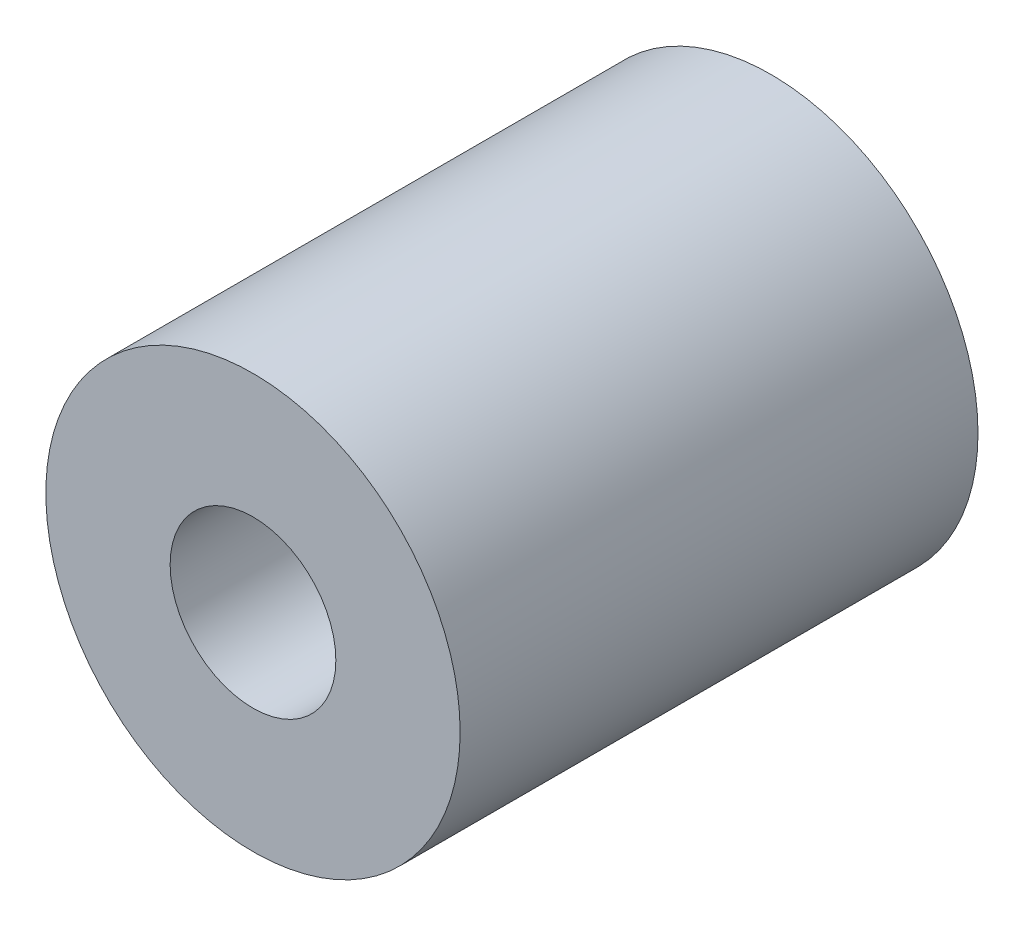
ISO-10303-21;
HEADER;
FILE_DESCRIPTION(('STEP AP214'),'2;1');
FILE_NAME('part.step','',(''),(''),'','','');
FILE_SCHEMA(('AUTOMOTIVE_DESIGN { 1 0 10303 214 1 1 1 1 }'));
ENDSEC;
DATA;
#1=APPLICATION_CONTEXT('core data for automotive mechanical design processes');
#2=APPLICATION_PROTOCOL_DEFINITION('international standard','automotive_design',2000,#1);
#3=PRODUCT_CONTEXT('',#1,'mechanical');
#4=PRODUCT('Part','Part','',(#3));
#5=PRODUCT_RELATED_PRODUCT_CATEGORY('part','',(#4));
#6=PRODUCT_DEFINITION_FORMATION('','',#4);
#7=PRODUCT_DEFINITION_CONTEXT('part definition',#1,'design');
#8=PRODUCT_DEFINITION('design','',#6,#7);
#9=PRODUCT_DEFINITION_SHAPE('','',#8);
#10=(LENGTH_UNIT() NAMED_UNIT(*) SI_UNIT(.MILLI.,.METRE.));
#11=(NAMED_UNIT(*) PLANE_ANGLE_UNIT() SI_UNIT($,.RADIAN.));
#12=(NAMED_UNIT(*) SI_UNIT($,.STERADIAN.) SOLID_ANGLE_UNIT());
#13=UNCERTAINTY_MEASURE_WITH_UNIT(LENGTH_MEASURE(1.E-05),#10,'distance_accuracy_value','');
#14=(GEOMETRIC_REPRESENTATION_CONTEXT(3) GLOBAL_UNCERTAINTY_ASSIGNED_CONTEXT((#13)) GLOBAL_UNIT_ASSIGNED_CONTEXT((#10,
#11,#12)) REPRESENTATION_CONTEXT('',''));
#15=CARTESIAN_POINT('',(0.,0.,0.));
#16=DIRECTION('',(0.,0.,1.));
#17=DIRECTION('',(1.,0.,0.));
#18=AXIS2_PLACEMENT_3D('',#15,#16,#17);
#19=CARTESIAN_POINT('',(0.,0.,25.));
#20=DIRECTION('',(0.,0.,-1.));
#21=DIRECTION('',(-1.,0.,0.));
#22=AXIS2_PLACEMENT_3D('',#19,#20,#21);
#23=CYLINDRICAL_SURFACE('',#22,10.);
#24=CARTESIAN_POINT('',(0.,0.,25.));
#25=DIRECTION('',(0.,0.,1.));
#26=DIRECTION('',(1.,0.,0.));
#27=AXIS2_PLACEMENT_3D('',#24,#25,#26);
#28=CIRCLE('',#27,10.);
#29=CARTESIAN_POINT('',(10.,0.,25.));
#30=VERTEX_POINT('',#29);
#31=EDGE_CURVE('E10',#30,#30,#28,.T.);
#32=ORIENTED_EDGE('',*,*,#31,.F.);
#33=EDGE_LOOP('',(#32));
#34=FACE_BOUND('',#33,.T.);
#35=CARTESIAN_POINT('',(0.,0.,0.));
#36=DIRECTION('',(0.,0.,1.));
#37=DIRECTION('',(1.,0.,0.));
#38=AXIS2_PLACEMENT_3D('',#35,#36,#37);
#39=CIRCLE('',#38,10.);
#40=CARTESIAN_POINT('',(10.,0.,0.));
#41=VERTEX_POINT('',#40);
#42=EDGE_CURVE('E44',#41,#41,#39,.T.);
#43=ORIENTED_EDGE('',*,*,#42,.T.);
#44=EDGE_LOOP('',(#43));
#45=FACE_BOUND('',#44,.T.);
#46=ADVANCED_FACE('F37',(#34,#45),#23,.T.);
#47=CARTESIAN_POINT('',(0.,0.,25.));
#48=DIRECTION('',(0.,0.,1.));
#49=DIRECTION('',(1.,0.,0.));
#50=AXIS2_PLACEMENT_3D('',#47,#48,#49);
#51=PLANE('',#50);
#52=CARTESIAN_POINT('',(0.,0.,25.));
#53=DIRECTION('',(0.,0.,1.));
#54=DIRECTION('',(1.,0.,0.));
#55=AXIS2_PLACEMENT_3D('',#52,#53,#54);
#56=CIRCLE('',#55,4.);
#57=CARTESIAN_POINT('',(4.,0.,25.));
#58=VERTEX_POINT('',#57);
#59=EDGE_CURVE('E49',#58,#58,#56,.T.);
#60=ORIENTED_EDGE('',*,*,#59,.F.);
#61=EDGE_LOOP('',(#60));
#62=FACE_BOUND('',#61,.T.);
#63=ORIENTED_EDGE('',*,*,#31,.T.);
#64=EDGE_LOOP('',(#63));
#65=FACE_BOUND('',#64,.T.);
#66=ADVANCED_FACE('F72',(#62,#65),#51,.T.);
#67=CARTESIAN_POINT('',(0.,0.,0.));
#68=DIRECTION('',(0.,0.,1.));
#69=DIRECTION('',(1.,0.,0.));
#70=AXIS2_PLACEMENT_3D('',#67,#68,#69);
#71=PLANE('',#70);
#72=CARTESIAN_POINT('',(0.,0.,0.));
#73=DIRECTION('',(0.,0.,-1.));
#74=DIRECTION('',(-1.,0.,0.));
#75=AXIS2_PLACEMENT_3D('',#72,#73,#74);
#76=CIRCLE('',#75,5.);
#77=CARTESIAN_POINT('',(-5.,0.,0.));
#78=VERTEX_POINT('',#77);
#79=EDGE_CURVE('E54',#78,#78,#76,.T.);
#80=ORIENTED_EDGE('',*,*,#79,.F.);
#81=EDGE_LOOP('',(#80));
#82=FACE_BOUND('',#81,.T.);
#83=ORIENTED_EDGE('',*,*,#42,.F.);
#84=EDGE_LOOP('',(#83));
#85=FACE_BOUND('',#84,.T.);
#86=ADVANCED_FACE('F69',(#82,#85),#71,.F.);
#87=CARTESIAN_POINT('',(0.,0.,17.5));
#88=DIRECTION('',(0.,0.,1.));
#89=DIRECTION('',(1.,0.,0.));
#90=AXIS2_PLACEMENT_3D('',#87,#88,#89);
#91=CYLINDRICAL_SURFACE('',#90,4.);
#92=ORIENTED_EDGE('',*,*,#59,.T.);
#93=EDGE_LOOP('',(#92));
#94=FACE_BOUND('',#93,.T.);
#95=CARTESIAN_POINT('',(0.,0.,12.5));
#96=DIRECTION('',(0.,0.,-1.));
#97=DIRECTION('',(-1.,0.,0.));
#98=AXIS2_PLACEMENT_3D('',#95,#96,#97);
#99=CIRCLE('',#98,4.);
#100=CARTESIAN_POINT('',(-4.,0.,12.5));
#101=VERTEX_POINT('',#100);
#102=EDGE_CURVE('E40',#101,#101,#99,.T.);
#103=ORIENTED_EDGE('',*,*,#102,.T.);
#104=EDGE_LOOP('',(#103));
#105=FACE_BOUND('',#104,.T.);
#106=ADVANCED_FACE('F65',(#94,#105),#91,.F.);
#107=CARTESIAN_POINT('',(0.,0.,12.5));
#108=DIRECTION('',(0.,0.,-1.));
#109=DIRECTION('',(-1.,0.,0.));
#110=AXIS2_PLACEMENT_3D('',#107,#108,#109);
#111=CYLINDRICAL_SURFACE('',#110,5.);
#112=CARTESIAN_POINT('',(0.,0.,12.5));
#113=DIRECTION('',(0.,0.,-1.));
#114=DIRECTION('',(-1.,0.,0.));
#115=AXIS2_PLACEMENT_3D('',#112,#113,#114);
#116=CIRCLE('',#115,5.);
#117=CARTESIAN_POINT('',(-5.,0.,12.5));
#118=VERTEX_POINT('',#117);
#119=EDGE_CURVE('E53',#118,#118,#116,.T.);
#120=ORIENTED_EDGE('',*,*,#119,.F.);
#121=EDGE_LOOP('',(#120));
#122=FACE_BOUND('',#121,.T.);
#123=ORIENTED_EDGE('',*,*,#79,.T.);
#124=EDGE_LOOP('',(#123));
#125=FACE_BOUND('',#124,.T.);
#126=ADVANCED_FACE('F62',(#122,#125),#111,.F.);
#127=CARTESIAN_POINT('',(0.,0.,12.5));
#128=DIRECTION('',(0.,0.,-1.));
#129=DIRECTION('',(-1.,0.,0.));
#130=AXIS2_PLACEMENT_3D('',#127,#128,#129);
#131=PLANE('',#130);
#132=ORIENTED_EDGE('',*,*,#102,.F.);
#133=EDGE_LOOP('',(#132));
#134=FACE_BOUND('',#133,.T.);
#135=ORIENTED_EDGE('',*,*,#119,.T.);
#136=EDGE_LOOP('',(#135));
#137=FACE_BOUND('',#136,.T.);
#138=ADVANCED_FACE('F60',(#134,#137),#131,.T.);
#139=CLOSED_SHELL('',(#46,#66,#86,#106,#126,#138));
#140=MANIFOLD_SOLID_BREP('B2',#139);
#141=ADVANCED_BREP_SHAPE_REPRESENTATION('',(#18,#140),#14);
#142=SHAPE_DEFINITION_REPRESENTATION(#9,#141);
ENDSEC;
END-ISO-10303-21;
